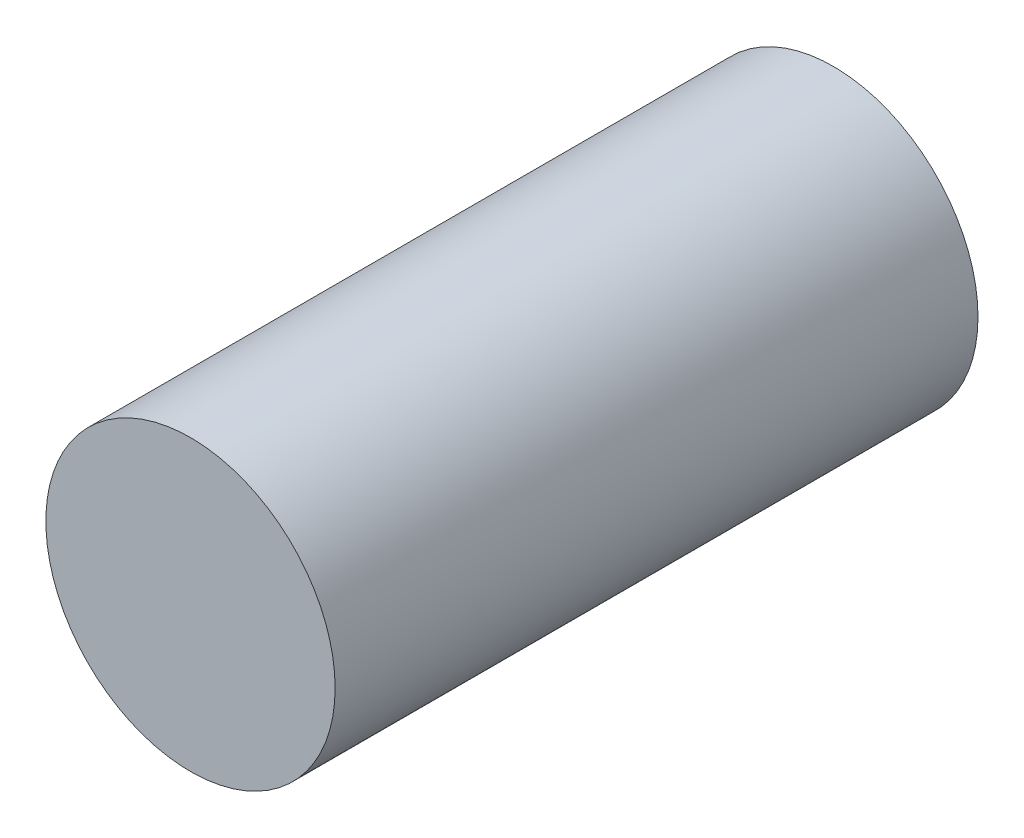
ISO-10303-21;
HEADER;
FILE_DESCRIPTION(('STEP AP214'),'2;1');
FILE_NAME('part.step','',(''),(''),'','','');
FILE_SCHEMA(('AUTOMOTIVE_DESIGN { 1 0 10303 214 1 1 1 1 }'));
ENDSEC;
DATA;
#1=APPLICATION_CONTEXT('core data for automotive mechanical design processes');
#2=APPLICATION_PROTOCOL_DEFINITION('international standard','automotive_design',2000,#1);
#3=PRODUCT_CONTEXT('',#1,'mechanical');
#4=PRODUCT('Part','Part','',(#3));
#5=PRODUCT_RELATED_PRODUCT_CATEGORY('part','',(#4));
#6=PRODUCT_DEFINITION_FORMATION('','',#4);
#7=PRODUCT_DEFINITION_CONTEXT('part definition',#1,'design');
#8=PRODUCT_DEFINITION('design','',#6,#7);
#9=PRODUCT_DEFINITION_SHAPE('','',#8);
#10=(LENGTH_UNIT() NAMED_UNIT(*) SI_UNIT(.MILLI.,.METRE.));
#11=(NAMED_UNIT(*) PLANE_ANGLE_UNIT() SI_UNIT($,.RADIAN.));
#12=(NAMED_UNIT(*) SI_UNIT($,.STERADIAN.) SOLID_ANGLE_UNIT());
#13=UNCERTAINTY_MEASURE_WITH_UNIT(LENGTH_MEASURE(1.E-05),#10,'distance_accuracy_value','');
#14=(GEOMETRIC_REPRESENTATION_CONTEXT(3) GLOBAL_UNCERTAINTY_ASSIGNED_CONTEXT((#13)) GLOBAL_UNIT_ASSIGNED_CONTEXT((#10,
#11,#12)) REPRESENTATION_CONTEXT('',''));
#15=CARTESIAN_POINT('',(0.,0.,0.));
#16=DIRECTION('',(0.,0.,1.));
#17=DIRECTION('',(1.,0.,0.));
#18=AXIS2_PLACEMENT_3D('',#15,#16,#17);
#19=CARTESIAN_POINT('',(0.,0.,160.));
#20=DIRECTION('',(0.,0.,-1.));
#21=DIRECTION('',(-1.,0.,0.));
#22=AXIS2_PLACEMENT_3D('',#19,#20,#21);
#23=CYLINDRICAL_SURFACE('',#22,36.);
#24=CARTESIAN_POINT('',(0.,0.,160.));
#25=DIRECTION('',(0.,0.,1.));
#26=DIRECTION('',(1.,0.,0.));
#27=AXIS2_PLACEMENT_3D('',#24,#25,#26);
#28=CIRCLE('',#27,36.);
#29=CARTESIAN_POINT('',(36.,0.,160.));
#30=VERTEX_POINT('',#29);
#31=EDGE_CURVE('E10',#30,#30,#28,.T.);
#32=ORIENTED_EDGE('',*,*,#31,.F.);
#33=EDGE_LOOP('',(#32));
#34=FACE_BOUND('',#33,.T.);
#35=CARTESIAN_POINT('',(0.,0.,0.));
#36=DIRECTION('',(0.,0.,1.));
#37=DIRECTION('',(1.,0.,0.));
#38=AXIS2_PLACEMENT_3D('',#35,#36,#37);
#39=CIRCLE('',#38,36.);
#40=CARTESIAN_POINT('',(36.,0.,0.));
#41=VERTEX_POINT('',#40);
#42=EDGE_CURVE('E43',#41,#41,#39,.T.);
#43=ORIENTED_EDGE('',*,*,#42,.T.);
#44=EDGE_LOOP('',(#43));
#45=FACE_BOUND('',#44,.T.);
#46=ADVANCED_FACE('F40',(#34,#45),#23,.T.);
#47=CARTESIAN_POINT('',(0.,0.,160.));
#48=DIRECTION('',(0.,0.,1.));
#49=DIRECTION('',(1.,0.,0.));
#50=AXIS2_PLACEMENT_3D('',#47,#48,#49);
#51=PLANE('',#50);
#52=ORIENTED_EDGE('',*,*,#31,.T.);
#53=EDGE_LOOP('',(#52));
#54=FACE_BOUND('',#53,.T.);
#55=ADVANCED_FACE('F75',(#54),#51,.T.);
#56=CARTESIAN_POINT('',(0.,0.,0.));
#57=DIRECTION('',(0.,0.,1.));
#58=DIRECTION('',(1.,0.,0.));
#59=AXIS2_PLACEMENT_3D('',#56,#57,#58);
#60=PLANE('',#59);
#61=ORIENTED_EDGE('',*,*,#42,.F.);
#62=EDGE_LOOP('',(#61));
#63=FACE_BOUND('',#62,.T.);
#64=ADVANCED_FACE('F77',(#63),#60,.F.);
#65=CLOSED_SHELL('',(#46,#55,#64));
#66=CARTESIAN_POINT('',(0.,0.,158.));
#67=DIRECTION('',(0.,0.,-1.));
#68=DIRECTION('',(-1.,0.,0.));
#69=AXIS2_PLACEMENT_3D('',#66,#67,#68);
#70=CYLINDRICAL_SURFACE('',#69,34.);
#71=CARTESIAN_POINT('',(0.,0.,158.));
#72=DIRECTION('',(0.,0.,1.));
#73=DIRECTION('',(1.,0.,0.));
#74=AXIS2_PLACEMENT_3D('',#71,#72,#73);
#75=CIRCLE('',#74,34.);
#76=CARTESIAN_POINT('',(34.,0.,158.));
#77=VERTEX_POINT('',#76);
#78=EDGE_CURVE('E50',#77,#77,#75,.T.);
#79=ORIENTED_EDGE('',*,*,#78,.T.);
#80=EDGE_LOOP('',(#79));
#81=FACE_BOUND('',#80,.T.);
#82=CARTESIAN_POINT('',(0.,0.,2.));
#83=DIRECTION('',(0.,0.,1.));
#84=DIRECTION('',(1.,0.,0.));
#85=AXIS2_PLACEMENT_3D('',#82,#83,#84);
#86=CIRCLE('',#85,34.);
#87=CARTESIAN_POINT('',(34.,0.,2.));
#88=VERTEX_POINT('',#87);
#89=EDGE_CURVE('E52',#88,#88,#86,.T.);
#90=ORIENTED_EDGE('',*,*,#89,.F.);
#91=EDGE_LOOP('',(#90));
#92=FACE_BOUND('',#91,.T.);
#93=ADVANCED_FACE('F58',(#81,#92),#70,.F.);
#94=CARTESIAN_POINT('',(0.,0.,158.));
#95=DIRECTION('',(0.,0.,1.));
#96=DIRECTION('',(1.,0.,0.));
#97=AXIS2_PLACEMENT_3D('',#94,#95,#96);
#98=PLANE('',#97);
#99=ORIENTED_EDGE('',*,*,#78,.F.);
#100=EDGE_LOOP('',(#99));
#101=FACE_BOUND('',#100,.T.);
#102=ADVANCED_FACE('F61',(#101),#98,.F.);
#103=CARTESIAN_POINT('',(0.,0.,2.));
#104=DIRECTION('',(0.,0.,1.));
#105=DIRECTION('',(1.,0.,0.));
#106=AXIS2_PLACEMENT_3D('',#103,#104,#105);
#107=PLANE('',#106);
#108=ORIENTED_EDGE('',*,*,#89,.T.);
#109=EDGE_LOOP('',(#108));
#110=FACE_BOUND('',#109,.T.);
#111=ADVANCED_FACE('F63',(#110),#107,.T.);
#112=CLOSED_SHELL('',(#93,#102,#111));
#113=ORIENTED_CLOSED_SHELL('',*,#112,.T.);
#114=BREP_WITH_VOIDS('B2',#65,(#113));
#115=ADVANCED_BREP_SHAPE_REPRESENTATION('',(#18,#114),#14);
#116=SHAPE_DEFINITION_REPRESENTATION(#9,#115);
ENDSEC;
END-ISO-10303-21;
